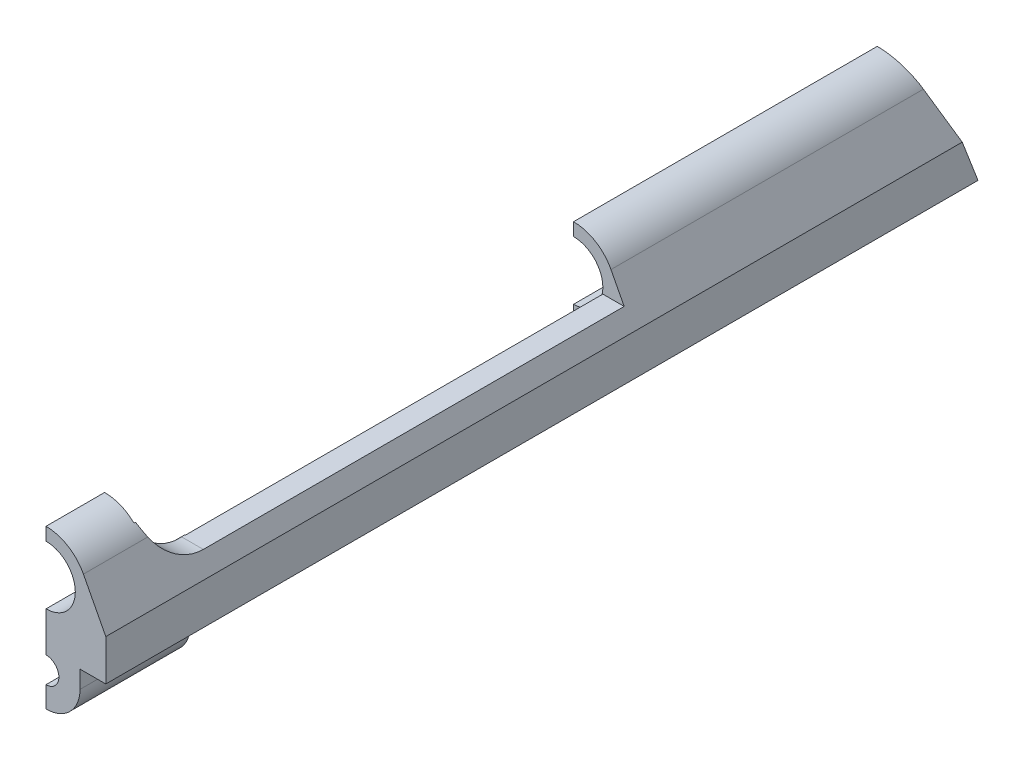
ISO-10303-21;
HEADER;
FILE_DESCRIPTION(('STEP AP214'),'2;1');
FILE_NAME('part.step','',(''),(''),'','','');
FILE_SCHEMA(('AUTOMOTIVE_DESIGN { 1 0 10303 214 1 1 1 1 }'));
ENDSEC;
DATA;
#1=APPLICATION_CONTEXT('core data for automotive mechanical design processes');
#2=APPLICATION_PROTOCOL_DEFINITION('international standard','automotive_design',2000,#1);
#3=PRODUCT_CONTEXT('',#1,'mechanical');
#4=PRODUCT('Part','Part','',(#3));
#5=PRODUCT_RELATED_PRODUCT_CATEGORY('part','',(#4));
#6=PRODUCT_DEFINITION_FORMATION('','',#4);
#7=PRODUCT_DEFINITION_CONTEXT('part definition',#1,'design');
#8=PRODUCT_DEFINITION('design','',#6,#7);
#9=PRODUCT_DEFINITION_SHAPE('','',#8);
#10=(LENGTH_UNIT() NAMED_UNIT(*) SI_UNIT(.MILLI.,.METRE.));
#11=(NAMED_UNIT(*) PLANE_ANGLE_UNIT() SI_UNIT($,.RADIAN.));
#12=(NAMED_UNIT(*) SI_UNIT($,.STERADIAN.) SOLID_ANGLE_UNIT());
#13=UNCERTAINTY_MEASURE_WITH_UNIT(LENGTH_MEASURE(1.E-05),#10,'distance_accuracy_value','');
#14=(GEOMETRIC_REPRESENTATION_CONTEXT(3) GLOBAL_UNCERTAINTY_ASSIGNED_CONTEXT((#13)) GLOBAL_UNIT_ASSIGNED_CONTEXT((#10,
#11,#12)) REPRESENTATION_CONTEXT('',''));
#15=CARTESIAN_POINT('',(0.,0.,0.));
#16=DIRECTION('',(0.,0.,1.));
#17=DIRECTION('',(1.,0.,0.));
#18=AXIS2_PLACEMENT_3D('',#15,#16,#17);
#19=CARTESIAN_POINT('',(0.,0.,0.));
#20=DIRECTION('',(-1.,0.,0.));
#21=DIRECTION('',(0.,0.,1.));
#22=AXIS2_PLACEMENT_3D('',#19,#20,#21);
#23=PLANE('',#22);
#24=DIRECTION('',(0.,-0.9335804264972,-0.358367949545305));
#25=VECTOR('',#24,1.);
#26=CARTESIAN_POINT('',(0.,64.6601194488688,-168.445370098041));
#27=LINE('',#26,#25);
#28=CARTESIAN_POINT('',(0.,18.542,-186.148457517929));
#29=VERTEX_POINT('',#28);
#30=CARTESIAN_POINT('',(0.,34.29,-180.103366694191));
#31=VERTEX_POINT('',#30);
#32=EDGE_CURVE('E68',#29,#31,#27,.F.);
#33=ORIENTED_EDGE('',*,*,#32,.F.);
#34=DIRECTION('',(0.,0.,-1.));
#35=VECTOR('',#34,1.);
#36=CARTESIAN_POINT('',(0.,18.542,-121.666));
#37=LINE('',#36,#35);
#38=CARTESIAN_POINT('',(0.,18.542,-121.666));
#39=VERTEX_POINT('',#38);
#40=EDGE_CURVE('E78',#39,#29,#37,.T.);
#41=ORIENTED_EDGE('',*,*,#40,.F.);
#42=DIRECTION('',(0.,-1.,0.));
#43=VECTOR('',#42,1.);
#44=CARTESIAN_POINT('',(0.,0.,-121.666));
#45=LINE('',#44,#43);
#46=CARTESIAN_POINT('',(0.,11.176,-121.666));
#47=VERTEX_POINT('',#46);
#48=EDGE_CURVE('E412',#39,#47,#45,.T.);
#49=ORIENTED_EDGE('',*,*,#48,.T.);
#50=DIRECTION('',(0.,0.,-1.));
#51=VECTOR('',#50,1.);
#52=CARTESIAN_POINT('',(0.,11.176,-188.976));
#53=LINE('',#52,#51);
#54=CARTESIAN_POINT('',(0.,11.176,-114.3));
#55=VERTEX_POINT('',#54);
#56=EDGE_CURVE('E275',#55,#47,#53,.T.);
#57=ORIENTED_EDGE('',*,*,#56,.F.);
#58=DIRECTION('',(0.,1.,0.));
#59=VECTOR('',#58,1.);
#60=CARTESIAN_POINT('',(0.,0.,-114.3));
#61=LINE('',#60,#59);
#62=CARTESIAN_POINT('',(0.,18.796,-114.3));
#63=VERTEX_POINT('',#62);
#64=EDGE_CURVE('E243',#55,#63,#61,.T.);
#65=ORIENTED_EDGE('',*,*,#64,.T.);
#66=DIRECTION('',(0.,0.,1.));
#67=VECTOR('',#66,1.);
#68=CARTESIAN_POINT('',(0.,18.796,-121.412));
#69=LINE('',#68,#67);
#70=CARTESIAN_POINT('',(0.,18.796,-121.412));
#71=VERTEX_POINT('',#70);
#72=EDGE_CURVE('E301',#71,#63,#69,.T.);
#73=ORIENTED_EDGE('',*,*,#72,.F.);
#74=DIRECTION('',(0.,-1.,0.));
#75=VECTOR('',#74,1.);
#76=CARTESIAN_POINT('',(0.,0.,-121.412));
#77=LINE('',#76,#75);
#78=CARTESIAN_POINT('',(0.,31.496,-121.412));
#79=VERTEX_POINT('',#78);
#80=EDGE_CURVE('E289',#79,#71,#77,.T.);
#81=ORIENTED_EDGE('',*,*,#80,.F.);
#82=DIRECTION('',(0.,0.,1.));
#83=VECTOR('',#82,1.);
#84=CARTESIAN_POINT('',(0.,31.496,-121.412));
#85=LINE('',#84,#83);
#86=CARTESIAN_POINT('',(0.,31.496,-114.3));
#87=VERTEX_POINT('',#86);
#88=EDGE_CURVE('E296',#79,#87,#85,.T.);
#89=ORIENTED_EDGE('',*,*,#88,.T.);
#90=CARTESIAN_POINT('',(0.,34.29,-114.3));
#91=VERTEX_POINT('',#90);
#92=EDGE_CURVE('E240',#87,#91,#61,.T.);
#93=ORIENTED_EDGE('',*,*,#92,.T.);
#94=DIRECTION('',(0.,0.,1.));
#95=VECTOR('',#94,1.);
#96=CARTESIAN_POINT('',(0.,34.29,0.));
#97=LINE('',#96,#95);
#98=EDGE_CURVE('E307',#31,#91,#97,.T.);
#99=ORIENTED_EDGE('',*,*,#98,.F.);
#100=EDGE_LOOP('',(#33,#41,#49,#57,#65,#73,#81,#89,#93,#99));
#101=FACE_BOUND('',#100,.T.);
#102=ADVANCED_FACE('F34',(#101),#23,.T.);
#103=CARTESIAN_POINT('',(12.954,11.176,-188.976));
#104=DIRECTION('',(0.,1.,0.));
#105=DIRECTION('',(0.,0.,1.));
#106=AXIS2_PLACEMENT_3D('',#103,#104,#105);
#107=PLANE('',#106);
#108=DIRECTION('',(0.,0.,-1.));
#109=VECTOR('',#108,1.);
#110=CARTESIAN_POINT('',(8.382,11.176,-121.666));
#111=LINE('',#110,#109);
#112=CARTESIAN_POINT('',(8.382,11.176,-121.666));
#113=VERTEX_POINT('',#112);
#114=CARTESIAN_POINT('',(8.382,11.176,-188.976));
#115=VERTEX_POINT('',#114);
#116=EDGE_CURVE('E359',#113,#115,#111,.T.);
#117=ORIENTED_EDGE('',*,*,#116,.T.);
#118=DIRECTION('',(-1.,0.,0.));
#119=VECTOR('',#118,1.);
#120=CARTESIAN_POINT('',(12.954,11.176,-188.976));
#121=LINE('',#120,#119);
#122=CARTESIAN_POINT('',(12.954,11.176,-188.976));
#123=VERTEX_POINT('',#122);
#124=EDGE_CURVE('E280',#123,#115,#121,.T.);
#125=ORIENTED_EDGE('',*,*,#124,.F.);
#126=DIRECTION('',(0.,0.,-1.));
#127=VECTOR('',#126,1.);
#128=CARTESIAN_POINT('',(12.954,11.176,-188.976));
#129=LINE('',#128,#127);
#130=CARTESIAN_POINT('',(12.954,11.176,0.));
#131=VERTEX_POINT('',#130);
#132=EDGE_CURVE('E271',#131,#123,#129,.T.);
#133=ORIENTED_EDGE('',*,*,#132,.F.);
#134=DIRECTION('',(1.,0.,0.));
#135=VECTOR('',#134,1.);
#136=CARTESIAN_POINT('',(0.,11.176,0.));
#137=LINE('',#136,#135);
#138=CARTESIAN_POINT('',(7.366,11.176,0.));
#139=VERTEX_POINT('',#138);
#140=EDGE_CURVE('E257',#139,#131,#137,.T.);
#141=ORIENTED_EDGE('',*,*,#140,.F.);
#142=DIRECTION('',(0.,0.,1.));
#143=VECTOR('',#142,1.);
#144=CARTESIAN_POINT('',(7.366,11.176,-25.4));
#145=LINE('',#144,#143);
#146=CARTESIAN_POINT('',(7.366,11.176,-23.876));
#147=VERTEX_POINT('',#146);
#148=EDGE_CURVE('E263',#147,#139,#145,.T.);
#149=ORIENTED_EDGE('',*,*,#148,.F.);
#150=DIRECTION('',(-1.,0.,0.));
#151=VECTOR('',#150,1.);
#152=CARTESIAN_POINT('',(12.954,11.176,-23.876));
#153=LINE('',#152,#151);
#154=CARTESIAN_POINT('',(6.35,11.176,-23.876));
#155=VERTEX_POINT('',#154);
#156=EDGE_CURVE('E274',#147,#155,#153,.T.);
#157=ORIENTED_EDGE('',*,*,#156,.T.);
#158=DIRECTION('',(0.,0.,-1.));
#159=VECTOR('',#158,1.);
#160=CARTESIAN_POINT('',(6.35,11.176,-188.976));
#161=LINE('',#160,#159);
#162=CARTESIAN_POINT('',(6.35,11.176,-114.3));
#163=VERTEX_POINT('',#162);
#164=EDGE_CURVE('E320',#155,#163,#161,.T.);
#165=ORIENTED_EDGE('',*,*,#164,.T.);
#166=DIRECTION('',(1.,0.,0.));
#167=VECTOR('',#166,1.);
#168=CARTESIAN_POINT('',(12.954,11.176,-114.3));
#169=LINE('',#168,#167);
#170=EDGE_CURVE('E323',#55,#163,#169,.T.);
#171=ORIENTED_EDGE('',*,*,#170,.F.);
#172=ORIENTED_EDGE('',*,*,#56,.T.);
#173=DIRECTION('',(-1.,0.,0.));
#174=VECTOR('',#173,1.);
#175=CARTESIAN_POINT('',(0.,11.176,-121.666));
#176=LINE('',#175,#174);
#177=EDGE_CURVE('E371',#113,#47,#176,.T.);
#178=ORIENTED_EDGE('',*,*,#177,.F.);
#179=EDGE_LOOP('',(#117,#125,#133,#141,#149,#157,#165,#171,#172,#178));
#180=FACE_BOUND('',#179,.T.);
#181=ADVANCED_FACE('F368',(#180),#107,.F.);
#182=CARTESIAN_POINT('',(12.954,64.6601194488688,-168.445370098041));
#183=DIRECTION('',(0.,-0.358367949545305,0.9335804264972));
#184=DIRECTION('',(0.,-0.9335804264972,-0.358367949545305));
#185=AXIS2_PLACEMENT_3D('',#182,#183,#184);
#186=PLANE('',#185);
#187=DIRECTION('',(1.,0.,0.));
#188=VECTOR('',#187,1.);
#189=CARTESIAN_POINT('',(12.954,18.542,-186.148457517929));
#190=LINE('',#189,#188);
#191=CARTESIAN_POINT('',(10.922,18.542,-186.148457517929));
#192=VERTEX_POINT('',#191);
#193=EDGE_CURVE('E11',#29,#192,#190,.T.);
#194=ORIENTED_EDGE('',*,*,#193,.F.);
#195=ORIENTED_EDGE('',*,*,#32,.T.);
#196=CARTESIAN_POINT('',(0.,25.146,-183.613419430555));
#197=DIRECTION('',(0.,-0.358367949545305,0.9335804264972));
#198=DIRECTION('',(0.,0.9335804264972,0.358367949545305));
#199=AXIS2_PLACEMENT_3D('',#196,#197,#198);
#200=ELLIPSE('',#199,9.79454982181702,9.14400000000001);
#201=CARTESIAN_POINT('',(8.11056319740007,29.3687361533702,-181.992462891833));
#202=VERTEX_POINT('',#201);
#203=EDGE_CURVE('E57',#31,#202,#200,.F.);
#204=ORIENTED_EDGE('',*,*,#203,.T.);
#205=DIRECTION('',(-0.437159423527798,0.839647328908161,0.3223104116814));
#206=VECTOR('',#205,1.);
#207=CARTESIAN_POINT('',(18.324635074471,9.7506798853615,-189.523129130422));
#208=LINE('',#207,#206);
#209=CARTESIAN_POINT('',(12.954,20.066,-185.563448728535));
#210=VERTEX_POINT('',#209);
#211=EDGE_CURVE('E337',#210,#202,#208,.T.);
#212=ORIENTED_EDGE('',*,*,#211,.F.);
#213=DIRECTION('',(0.,0.9335804264972,0.358367949545305));
#214=VECTOR('',#213,1.);
#215=CARTESIAN_POINT('',(12.954,64.6601194488688,-168.445370098041));
#216=LINE('',#215,#214);
#217=EDGE_CURVE('E375',#123,#210,#216,.T.);
#218=ORIENTED_EDGE('',*,*,#217,.F.);
#219=ORIENTED_EDGE('',*,*,#124,.T.);
#220=DIRECTION('',(0.,-0.9335804264972,-0.358367949545305));
#221=VECTOR('',#220,1.);
#222=CARTESIAN_POINT('',(8.382,64.6601194488688,-168.445370098041));
#223=LINE('',#222,#221);
#224=CARTESIAN_POINT('',(8.382,13.97,-187.903483886111));
#225=VERTEX_POINT('',#224);
#226=EDGE_CURVE('E42',#225,#115,#223,.T.);
#227=ORIENTED_EDGE('',*,*,#226,.F.);
#228=DIRECTION('',(1.,0.,0.));
#229=VECTOR('',#228,1.);
#230=CARTESIAN_POINT('',(12.954,13.97,-187.903483886111));
#231=LINE('',#230,#229);
#232=CARTESIAN_POINT('',(10.922,13.97,-187.903483886111));
#233=VERTEX_POINT('',#232);
#234=EDGE_CURVE('E347',#225,#233,#231,.T.);
#235=ORIENTED_EDGE('',*,*,#234,.T.);
#236=DIRECTION('',(0.,-0.9335804264972,-0.358367949545305));
#237=VECTOR('',#236,1.);
#238=CARTESIAN_POINT('',(10.922,64.6601194488688,-168.445370098041));
#239=LINE('',#238,#237);
#240=EDGE_CURVE('E339',#192,#233,#239,.T.);
#241=ORIENTED_EDGE('',*,*,#240,.F.);
#242=EDGE_LOOP('',(#194,#195,#204,#212,#218,#219,#227,#235,#241));
#243=FACE_BOUND('',#242,.T.);
#244=ADVANCED_FACE('F373',(#243),#186,.F.);
#245=CARTESIAN_POINT('',(6.35,0.,0.));
#246=DIRECTION('',(1.,0.,0.));
#247=DIRECTION('',(0.,0.,-1.));
#248=AXIS2_PLACEMENT_3D('',#245,#246,#247);
#249=PLANE('',#248);
#250=DIRECTION('',(0.,1.,0.));
#251=VECTOR('',#250,1.);
#252=CARTESIAN_POINT('',(6.35,0.,-23.876));
#253=LINE('',#252,#251);
#254=CARTESIAN_POINT('',(6.35,23.876,-23.876));
#255=VERTEX_POINT('',#254);
#256=EDGE_CURVE('E239',#155,#255,#253,.T.);
#257=ORIENTED_EDGE('',*,*,#256,.T.);
#258=DIRECTION('',(0.,0.,1.));
#259=VECTOR('',#258,1.);
#260=CARTESIAN_POINT('',(6.35,23.876,0.));
#261=LINE('',#260,#259);
#262=CARTESIAN_POINT('',(6.35,23.876,-114.3));
#263=VERTEX_POINT('',#262);
#264=EDGE_CURVE('E345',#263,#255,#261,.T.);
#265=ORIENTED_EDGE('',*,*,#264,.F.);
#266=DIRECTION('',(0.,1.,0.));
#267=VECTOR('',#266,1.);
#268=CARTESIAN_POINT('',(6.35,0.,-114.3));
#269=LINE('',#268,#267);
#270=EDGE_CURVE('E244',#163,#263,#269,.T.);
#271=ORIENTED_EDGE('',*,*,#270,.F.);
#272=ORIENTED_EDGE('',*,*,#164,.F.);
#273=EDGE_LOOP('',(#257,#265,#271,#272));
#274=FACE_BOUND('',#273,.T.);
#275=ADVANCED_FACE('F401',(#274),#249,.F.);
#276=CARTESIAN_POINT('',(0.,25.146,-188.976));
#277=DIRECTION('',(0.,0.,1.));
#278=DIRECTION('',(1.,0.,0.));
#279=AXIS2_PLACEMENT_3D('',#276,#277,#278);
#280=CYLINDRICAL_SURFACE('',#279,9.14400000000001);
#281=ORIENTED_EDGE('',*,*,#203,.F.);
#282=ORIENTED_EDGE('',*,*,#98,.T.);
#283=CARTESIAN_POINT('',(0.,25.146,-114.3));
#284=DIRECTION('',(0.,0.,1.));
#285=DIRECTION('',(1.,0.,0.));
#286=AXIS2_PLACEMENT_3D('',#283,#284,#285);
#287=CIRCLE('',#286,9.14400000000001);
#288=CARTESIAN_POINT('',(8.11056319740007,29.3687361533702,-114.3));
#289=VERTEX_POINT('',#288);
#290=EDGE_CURVE('E212',#289,#91,#287,.T.);
#291=ORIENTED_EDGE('',*,*,#290,.F.);
#292=DIRECTION('',(0.,0.,1.));
#293=VECTOR('',#292,1.);
#294=CARTESIAN_POINT('',(8.11056319740007,29.3687361533702,-188.976));
#295=LINE('',#294,#293);
#296=EDGE_CURVE('E525',#202,#289,#295,.T.);
#297=ORIENTED_EDGE('',*,*,#296,.F.);
#298=EDGE_LOOP('',(#281,#282,#291,#297));
#299=FACE_BOUND('',#298,.T.);
#300=ADVANCED_FACE('F470',(#299),#280,.T.);
#301=CARTESIAN_POINT('',(12.954,0.,0.));
#302=DIRECTION('',(0.,0.,-1.));
#303=DIRECTION('',(-1.,0.,0.));
#304=AXIS2_PLACEMENT_3D('',#301,#302,#303);
#305=PLANE('',#304);
#306=CARTESIAN_POINT('',(0.,25.146,0.));
#307=DIRECTION('',(0.,0.,1.));
#308=DIRECTION('',(1.,0.,0.));
#309=AXIS2_PLACEMENT_3D('',#306,#307,#308);
#310=CIRCLE('',#309,9.14400000000001);
#311=CARTESIAN_POINT('',(8.11056319740007,29.3687361533702,0.));
#312=VERTEX_POINT('',#311);
#313=CARTESIAN_POINT('',(0.,34.29,0.));
#314=VERTEX_POINT('',#313);
#315=EDGE_CURVE('E449',#312,#314,#310,.T.);
#316=ORIENTED_EDGE('',*,*,#315,.T.);
#317=DIRECTION('',(0.,-1.,0.));
#318=VECTOR('',#317,1.);
#319=CARTESIAN_POINT('',(0.,0.,0.));
#320=LINE('',#319,#318);
#321=CARTESIAN_POINT('',(0.,31.496,0.));
#322=VERTEX_POINT('',#321);
#323=EDGE_CURVE('E308',#314,#322,#320,.T.);
#324=ORIENTED_EDGE('',*,*,#323,.T.);
#325=CARTESIAN_POINT('',(0.,25.146,0.));
#326=DIRECTION('',(0.,0.,1.));
#327=DIRECTION('',(1.,0.,0.));
#328=AXIS2_PLACEMENT_3D('',#325,#326,#327);
#329=CIRCLE('',#328,6.35);
#330=CARTESIAN_POINT('',(0.,18.796,0.));
#331=VERTEX_POINT('',#330);
#332=EDGE_CURVE('E287',#331,#322,#329,.T.);
#333=ORIENTED_EDGE('',*,*,#332,.F.);
#334=CARTESIAN_POINT('',(0.,10.16,0.));
#335=VERTEX_POINT('',#334);
#336=EDGE_CURVE('E312',#331,#335,#320,.T.);
#337=ORIENTED_EDGE('',*,*,#336,.T.);
#338=CARTESIAN_POINT('',(0.,7.366,0.));
#339=DIRECTION('',(0.,0.,1.));
#340=DIRECTION('',(1.,0.,0.));
#341=AXIS2_PLACEMENT_3D('',#338,#339,#340);
#342=CIRCLE('',#341,2.794);
#343=CARTESIAN_POINT('',(0.,4.572,0.));
#344=VERTEX_POINT('',#343);
#345=EDGE_CURVE('E281',#344,#335,#342,.T.);
#346=ORIENTED_EDGE('',*,*,#345,.F.);
#347=CARTESIAN_POINT('',(0.,0.,0.));
#348=VERTEX_POINT('',#347);
#349=EDGE_CURVE('E299',#344,#348,#320,.T.);
#350=ORIENTED_EDGE('',*,*,#349,.T.);
#351=CARTESIAN_POINT('',(0.,7.366,0.));
#352=DIRECTION('',(0.,0.,1.));
#353=DIRECTION('',(1.,0.,0.));
#354=AXIS2_PLACEMENT_3D('',#351,#352,#353);
#355=CIRCLE('',#354,7.366);
#356=CARTESIAN_POINT('',(7.366,7.366,0.));
#357=VERTEX_POINT('',#356);
#358=EDGE_CURVE('E254',#348,#357,#355,.T.);
#359=ORIENTED_EDGE('',*,*,#358,.T.);
#360=DIRECTION('',(0.,1.,0.));
#361=VECTOR('',#360,1.);
#362=CARTESIAN_POINT('',(7.366,0.,0.));
#363=LINE('',#362,#361);
#364=EDGE_CURVE('E260',#357,#139,#363,.T.);
#365=ORIENTED_EDGE('',*,*,#364,.T.);
#366=ORIENTED_EDGE('',*,*,#140,.T.);
#367=DIRECTION('',(0.,-1.,0.));
#368=VECTOR('',#367,1.);
#369=CARTESIAN_POINT('',(12.954,0.,0.));
#370=LINE('',#369,#368);
#371=CARTESIAN_POINT('',(12.954,20.066,0.));
#372=VERTEX_POINT('',#371);
#373=EDGE_CURVE('E304',#372,#131,#370,.T.);
#374=ORIENTED_EDGE('',*,*,#373,.F.);
#375=DIRECTION('',(0.461804041269704,-0.886981976968512,0.));
#376=VECTOR('',#375,1.);
#377=CARTESIAN_POINT('',(18.410663066615,9.58544686068576,0.));
#378=LINE('',#377,#376);
#379=EDGE_CURVE('E528',#312,#372,#378,.T.);
#380=ORIENTED_EDGE('',*,*,#379,.F.);
#381=EDGE_LOOP('',(#316,#324,#333,#337,#346,#350,#359,#365,#366,#374,#380));
#382=FACE_BOUND('',#381,.T.);
#383=ADVANCED_FACE('F36',(#382),#305,.F.);
#384=DIRECTION('',(0.,0.,1.));
#385=VECTOR('',#384,1.);
#386=CARTESIAN_POINT('',(6.35,31.7255315942702,-188.976));
#387=LINE('',#386,#385);
#388=CARTESIAN_POINT('',(6.35,31.7255315942702,-13.0206904438626));
#389=VERTEX_POINT('',#388);
#390=CARTESIAN_POINT('',(6.35,31.7255315942702,-12.7));
#391=VERTEX_POINT('',#390);
#392=EDGE_CURVE('E202',#389,#391,#387,.T.);
#393=ORIENTED_EDGE('',*,*,#392,.F.);
#394=CARTESIAN_POINT('',(6.35,34.29,-23.114));
#395=DIRECTION('',(-1.,0.,0.));
#396=DIRECTION('',(0.,0.,1.));
#397=AXIS2_PLACEMENT_3D('',#394,#395,#396);
#398=CIRCLE('',#397,10.414);
#399=CARTESIAN_POINT('',(6.35,23.876,-23.114));
#400=VERTEX_POINT('',#399);
#401=EDGE_CURVE('E436',#400,#389,#398,.T.);
#402=ORIENTED_EDGE('',*,*,#401,.F.);
#403=DIRECTION('',(0.,0.,-1.));
#404=VECTOR('',#403,1.);
#405=CARTESIAN_POINT('',(6.35,23.876,0.));
#406=LINE('',#405,#404);
#407=CARTESIAN_POINT('',(6.35,23.876,-12.7));
#408=VERTEX_POINT('',#407);
#409=EDGE_CURVE('E520',#408,#400,#406,.T.);
#410=ORIENTED_EDGE('',*,*,#409,.F.);
#411=DIRECTION('',(0.,1.,0.));
#412=VECTOR('',#411,1.);
#413=CARTESIAN_POINT('',(6.35,23.876,-12.7));
#414=LINE('',#413,#412);
#415=CARTESIAN_POINT('',(6.35,25.146,-12.7));
#416=VERTEX_POINT('',#415);
#417=EDGE_CURVE('E229',#408,#416,#414,.T.);
#418=ORIENTED_EDGE('',*,*,#417,.T.);
#419=EDGE_CURVE('E218',#416,#391,#414,.T.);
#420=ORIENTED_EDGE('',*,*,#419,.T.);
#421=EDGE_LOOP('',(#393,#402,#410,#418,#420));
#422=FACE_BOUND('',#421,.T.);
#423=ADVANCED_FACE('F226',(#422),#249,.F.);
#424=CARTESIAN_POINT('',(0.,23.876,-12.7));
#425=DIRECTION('',(0.,0.,1.));
#426=DIRECTION('',(1.,0.,0.));
#427=AXIS2_PLACEMENT_3D('',#424,#425,#426);
#428=PLANE('',#427);
#429=CARTESIAN_POINT('',(0.,25.146,-12.7));
#430=DIRECTION('',(0.,0.,1.));
#431=DIRECTION('',(1.,0.,0.));
#432=AXIS2_PLACEMENT_3D('',#429,#430,#431);
#433=CIRCLE('',#432,9.14400000000001);
#434=CARTESIAN_POINT('',(0.,34.29,-12.7));
#435=VERTEX_POINT('',#434);
#436=EDGE_CURVE('E205',#391,#435,#433,.T.);
#437=ORIENTED_EDGE('',*,*,#436,.F.);
#438=ORIENTED_EDGE('',*,*,#419,.F.);
#439=CARTESIAN_POINT('',(0.,25.146,-12.7));
#440=DIRECTION('',(0.,0.,1.));
#441=DIRECTION('',(1.,0.,0.));
#442=AXIS2_PLACEMENT_3D('',#439,#440,#441);
#443=CIRCLE('',#442,6.35);
#444=CARTESIAN_POINT('',(0.,31.496,-12.7));
#445=VERTEX_POINT('',#444);
#446=EDGE_CURVE('E224',#445,#416,#443,.F.);
#447=ORIENTED_EDGE('',*,*,#446,.F.);
#448=DIRECTION('',(0.,1.,0.));
#449=VECTOR('',#448,1.);
#450=CARTESIAN_POINT('',(0.,23.876,-12.7));
#451=LINE('',#450,#449);
#452=EDGE_CURVE('E221',#445,#435,#451,.T.);
#453=ORIENTED_EDGE('',*,*,#452,.T.);
#454=EDGE_LOOP('',(#437,#438,#447,#453));
#455=FACE_BOUND('',#454,.T.);
#456=ADVANCED_FACE('F217',(#455),#428,.F.);
#457=CARTESIAN_POINT('',(0.,25.146,-121.412));
#458=DIRECTION('',(0.,0.,1.));
#459=DIRECTION('',(1.,0.,0.));
#460=AXIS2_PLACEMENT_3D('',#457,#458,#459);
#461=CYLINDRICAL_SURFACE('',#460,6.35);
#462=EDGE_CURVE('E300',#445,#322,#85,.T.);
#463=ORIENTED_EDGE('',*,*,#462,.F.);
#464=ORIENTED_EDGE('',*,*,#446,.T.);
#465=CARTESIAN_POINT('',(6.22170394666927,23.876,-12.7));
#466=VERTEX_POINT('',#465);
#467=EDGE_CURVE('E326',#416,#466,#443,.F.);
#468=ORIENTED_EDGE('',*,*,#467,.T.);
#469=DIRECTION('',(0.,0.,1.));
#470=VECTOR('',#469,1.);
#471=CARTESIAN_POINT('',(6.22170394666927,23.876,-121.412));
#472=LINE('',#471,#470);
#473=CARTESIAN_POINT('',(6.22170394666927,23.876,-23.876));
#474=VERTEX_POINT('',#473);
#475=EDGE_CURVE('E232',#474,#466,#472,.T.);
#476=ORIENTED_EDGE('',*,*,#475,.F.);
#477=CARTESIAN_POINT('',(0.,25.146,-23.876));
#478=DIRECTION('',(0.,0.,-1.));
#479=DIRECTION('',(-1.,0.,0.));
#480=AXIS2_PLACEMENT_3D('',#477,#478,#479);
#481=CIRCLE('',#480,6.35);
#482=CARTESIAN_POINT('',(0.,18.796,-23.876));
#483=VERTEX_POINT('',#482);
#484=EDGE_CURVE('E249',#483,#474,#481,.F.);
#485=ORIENTED_EDGE('',*,*,#484,.F.);
#486=EDGE_CURVE('E293',#483,#331,#69,.T.);
#487=ORIENTED_EDGE('',*,*,#486,.T.);
#488=ORIENTED_EDGE('',*,*,#332,.T.);
#489=EDGE_LOOP('',(#463,#464,#468,#476,#485,#487,#488));
#490=FACE_BOUND('',#489,.T.);
#491=ADVANCED_FACE('F487',(#490),#461,.F.);
#492=CARTESIAN_POINT('',(12.954,0.,-23.876));
#493=DIRECTION('',(0.,0.,1.));
#494=DIRECTION('',(1.,0.,0.));
#495=AXIS2_PLACEMENT_3D('',#492,#493,#494);
#496=PLANE('',#495);
#497=DIRECTION('',(-1.,0.,0.));
#498=VECTOR('',#497,1.);
#499=CARTESIAN_POINT('',(0.,23.876,-23.876));
#500=LINE('',#499,#498);
#501=EDGE_CURVE('E398',#255,#474,#500,.T.);
#502=ORIENTED_EDGE('',*,*,#501,.F.);
#503=ORIENTED_EDGE('',*,*,#256,.F.);
#504=ORIENTED_EDGE('',*,*,#156,.F.);
#505=DIRECTION('',(0.,1.,0.));
#506=VECTOR('',#505,1.);
#507=CARTESIAN_POINT('',(7.366,0.,-23.876));
#508=LINE('',#507,#506);
#509=CARTESIAN_POINT('',(7.366,7.366,-23.876));
#510=VERTEX_POINT('',#509);
#511=EDGE_CURVE('E266',#510,#147,#508,.T.);
#512=ORIENTED_EDGE('',*,*,#511,.F.);
#513=CARTESIAN_POINT('',(0.,7.366,-23.876));
#514=DIRECTION('',(0.,0.,1.));
#515=DIRECTION('',(1.,0.,0.));
#516=AXIS2_PLACEMENT_3D('',#513,#514,#515);
#517=CIRCLE('',#516,7.366);
#518=CARTESIAN_POINT('',(0.,0.,-23.876));
#519=VERTEX_POINT('',#518);
#520=EDGE_CURVE('E318',#519,#510,#517,.T.);
#521=ORIENTED_EDGE('',*,*,#520,.F.);
#522=DIRECTION('',(0.,1.,0.));
#523=VECTOR('',#522,1.);
#524=CARTESIAN_POINT('',(0.,0.,-23.876));
#525=LINE('',#524,#523);
#526=CARTESIAN_POINT('',(0.,4.572,-23.876));
#527=VERTEX_POINT('',#526);
#528=EDGE_CURVE('E276',#519,#527,#525,.T.);
#529=ORIENTED_EDGE('',*,*,#528,.T.);
#530=CARTESIAN_POINT('',(0.,7.366,-23.876));
#531=DIRECTION('',(0.,0.,1.));
#532=DIRECTION('',(1.,0.,0.));
#533=AXIS2_PLACEMENT_3D('',#530,#531,#532);
#534=CIRCLE('',#533,2.794);
#535=CARTESIAN_POINT('',(0.,10.16,-23.876));
#536=VERTEX_POINT('',#535);
#537=EDGE_CURVE('E306',#536,#527,#534,.F.);
#538=ORIENTED_EDGE('',*,*,#537,.F.);
#539=EDGE_CURVE('E270',#536,#483,#525,.T.);
#540=ORIENTED_EDGE('',*,*,#539,.T.);
#541=ORIENTED_EDGE('',*,*,#484,.T.);
#542=EDGE_LOOP('',(#502,#503,#504,#512,#521,#529,#538,#540,#541));
#543=FACE_BOUND('',#542,.T.);
#544=ADVANCED_FACE('F396',(#543),#496,.F.);
#545=ORIENTED_EDGE('',*,*,#452,.F.);
#546=ORIENTED_EDGE('',*,*,#462,.T.);
#547=ORIENTED_EDGE('',*,*,#323,.F.);
#548=EDGE_CURVE('E314',#435,#314,#97,.T.);
#549=ORIENTED_EDGE('',*,*,#548,.F.);
#550=EDGE_LOOP('',(#545,#546,#547,#549));
#551=FACE_BOUND('',#550,.T.);
#552=ADVANCED_FACE('F472',(#551),#23,.T.);
#553=ORIENTED_EDGE('',*,*,#486,.F.);
#554=ORIENTED_EDGE('',*,*,#539,.F.);
#555=DIRECTION('',(0.,0.,1.));
#556=VECTOR('',#555,1.);
#557=CARTESIAN_POINT('',(0.,10.16,-25.4));
#558=LINE('',#557,#556);
#559=EDGE_CURVE('E285',#536,#335,#558,.T.);
#560=ORIENTED_EDGE('',*,*,#559,.T.);
#561=ORIENTED_EDGE('',*,*,#336,.F.);
#562=EDGE_LOOP('',(#553,#554,#560,#561));
#563=FACE_BOUND('',#562,.T.);
#564=ADVANCED_FACE('F471',(#563),#23,.T.);
#565=ORIENTED_EDGE('',*,*,#72,.T.);
#566=CARTESIAN_POINT('',(0.,25.146,-114.3));
#567=DIRECTION('',(0.,0.,1.));
#568=DIRECTION('',(1.,0.,0.));
#569=AXIS2_PLACEMENT_3D('',#566,#567,#568);
#570=CIRCLE('',#569,6.35);
#571=EDGE_CURVE('E252',#87,#63,#570,.F.);
#572=ORIENTED_EDGE('',*,*,#571,.F.);
#573=ORIENTED_EDGE('',*,*,#88,.F.);
#574=CARTESIAN_POINT('',(0.,25.146,-121.412));
#575=DIRECTION('',(0.,0.,1.));
#576=DIRECTION('',(1.,0.,0.));
#577=AXIS2_PLACEMENT_3D('',#574,#575,#576);
#578=CIRCLE('',#577,6.35);
#579=EDGE_CURVE('E291',#71,#79,#578,.T.);
#580=ORIENTED_EDGE('',*,*,#579,.F.);
#581=EDGE_LOOP('',(#565,#572,#573,#580));
#582=FACE_BOUND('',#581,.T.);
#583=ADVANCED_FACE('F479',(#582),#461,.F.);
#584=CARTESIAN_POINT('',(12.954,0.,0.));
#585=DIRECTION('',(-1.,0.,0.));
#586=DIRECTION('',(0.,0.,1.));
#587=AXIS2_PLACEMENT_3D('',#584,#585,#586);
#588=PLANE('',#587);
#589=ORIENTED_EDGE('',*,*,#132,.T.);
#590=ORIENTED_EDGE('',*,*,#217,.T.);
#591=DIRECTION('',(0.,0.,1.));
#592=VECTOR('',#591,1.);
#593=CARTESIAN_POINT('',(12.954,20.066,-188.976));
#594=LINE('',#593,#592);
#595=EDGE_CURVE('E213',#210,#372,#594,.T.);
#596=ORIENTED_EDGE('',*,*,#595,.T.);
#597=ORIENTED_EDGE('',*,*,#373,.T.);
#598=EDGE_LOOP('',(#589,#590,#596,#597));
#599=FACE_BOUND('',#598,.T.);
#600=ADVANCED_FACE('F379',(#599),#588,.F.);
#601=ORIENTED_EDGE('',*,*,#528,.F.);
#602=DIRECTION('',(0.,0.,-1.));
#603=VECTOR('',#602,1.);
#604=CARTESIAN_POINT('',(0.,0.,0.));
#605=LINE('',#604,#603);
#606=EDGE_CURVE('E311',#348,#519,#605,.T.);
#607=ORIENTED_EDGE('',*,*,#606,.F.);
#608=ORIENTED_EDGE('',*,*,#349,.F.);
#609=DIRECTION('',(0.,0.,1.));
#610=VECTOR('',#609,1.);
#611=CARTESIAN_POINT('',(0.,4.572,-25.4));
#612=LINE('',#611,#610);
#613=EDGE_CURVE('E284',#527,#344,#612,.T.);
#614=ORIENTED_EDGE('',*,*,#613,.F.);
#615=EDGE_LOOP('',(#601,#607,#608,#614));
#616=FACE_BOUND('',#615,.T.);
#617=ADVANCED_FACE('F481',(#616),#23,.T.);
#618=CARTESIAN_POINT('',(0.,0.,-121.412));
#619=DIRECTION('',(0.,0.,1.));
#620=DIRECTION('',(1.,0.,0.));
#621=AXIS2_PLACEMENT_3D('',#618,#619,#620);
#622=PLANE('',#621);
#623=ORIENTED_EDGE('',*,*,#80,.T.);
#624=ORIENTED_EDGE('',*,*,#579,.T.);
#625=EDGE_LOOP('',(#623,#624));
#626=FACE_BOUND('',#625,.T.);
#627=ADVANCED_FACE('F490',(#626),#622,.T.);
#628=CARTESIAN_POINT('',(0.,7.366,-25.4));
#629=DIRECTION('',(0.,0.,1.));
#630=DIRECTION('',(1.,0.,0.));
#631=AXIS2_PLACEMENT_3D('',#628,#629,#630);
#632=CYLINDRICAL_SURFACE('',#631,2.794);
#633=ORIENTED_EDGE('',*,*,#559,.F.);
#634=ORIENTED_EDGE('',*,*,#537,.T.);
#635=ORIENTED_EDGE('',*,*,#613,.T.);
#636=ORIENTED_EDGE('',*,*,#345,.T.);
#637=EDGE_LOOP('',(#633,#634,#635,#636));
#638=FACE_BOUND('',#637,.T.);
#639=ADVANCED_FACE('F496',(#638),#632,.F.);
#640=CARTESIAN_POINT('',(0.,7.366,-25.4));
#641=DIRECTION('',(0.,0.,1.));
#642=DIRECTION('',(1.,0.,0.));
#643=AXIS2_PLACEMENT_3D('',#640,#641,#642);
#644=CYLINDRICAL_SURFACE('',#643,7.366);
#645=ORIENTED_EDGE('',*,*,#520,.T.);
#646=DIRECTION('',(0.,0.,1.));
#647=VECTOR('',#646,1.);
#648=CARTESIAN_POINT('',(7.366,7.366,-25.4));
#649=LINE('',#648,#647);
#650=EDGE_CURVE('E264',#510,#357,#649,.T.);
#651=ORIENTED_EDGE('',*,*,#650,.T.);
#652=ORIENTED_EDGE('',*,*,#358,.F.);
#653=ORIENTED_EDGE('',*,*,#606,.T.);
#654=EDGE_LOOP('',(#645,#651,#652,#653));
#655=FACE_BOUND('',#654,.T.);
#656=ADVANCED_FACE('F565',(#655),#644,.T.);
#657=CARTESIAN_POINT('',(7.366,0.,-25.4));
#658=DIRECTION('',(1.,0.,0.));
#659=DIRECTION('',(0.,0.,-1.));
#660=AXIS2_PLACEMENT_3D('',#657,#658,#659);
#661=PLANE('',#660);
#662=ORIENTED_EDGE('',*,*,#511,.T.);
#663=ORIENTED_EDGE('',*,*,#148,.T.);
#664=ORIENTED_EDGE('',*,*,#364,.F.);
#665=ORIENTED_EDGE('',*,*,#650,.F.);
#666=EDGE_LOOP('',(#662,#663,#664,#665));
#667=FACE_BOUND('',#666,.T.);
#668=ADVANCED_FACE('F389',(#667),#661,.T.);
#669=CARTESIAN_POINT('',(0.,0.,-114.3));
#670=DIRECTION('',(0.,0.,1.));
#671=DIRECTION('',(1.,0.,0.));
#672=AXIS2_PLACEMENT_3D('',#669,#670,#671);
#673=PLANE('',#672);
#674=ORIENTED_EDGE('',*,*,#571,.T.);
#675=ORIENTED_EDGE('',*,*,#64,.F.);
#676=ORIENTED_EDGE('',*,*,#170,.T.);
#677=ORIENTED_EDGE('',*,*,#270,.T.);
#678=DIRECTION('',(-1.,0.,0.));
#679=VECTOR('',#678,1.);
#680=CARTESIAN_POINT('',(12.954,23.876,-114.3));
#681=LINE('',#680,#679);
#682=CARTESIAN_POINT('',(10.9703369234953,23.876,-114.3));
#683=VERTEX_POINT('',#682);
#684=EDGE_CURVE('E439',#683,#263,#681,.T.);
#685=ORIENTED_EDGE('',*,*,#684,.F.);
#686=DIRECTION('',(0.461804041269704,-0.886981976968512,0.));
#687=VECTOR('',#686,1.);
#688=CARTESIAN_POINT('',(18.410663066615,9.58544686068576,-114.3));
#689=LINE('',#688,#687);
#690=EDGE_CURVE('E334',#289,#683,#689,.T.);
#691=ORIENTED_EDGE('',*,*,#690,.F.);
#692=ORIENTED_EDGE('',*,*,#290,.T.);
#693=ORIENTED_EDGE('',*,*,#92,.F.);
#694=EDGE_LOOP('',(#674,#675,#676,#677,#685,#691,#692,#693));
#695=FACE_BOUND('',#694,.T.);
#696=ADVANCED_FACE('F404',(#695),#673,.T.);
#697=ORIENTED_EDGE('',*,*,#417,.F.);
#698=DIRECTION('',(1.,0.,0.));
#699=VECTOR('',#698,1.);
#700=CARTESIAN_POINT('',(0.,23.876,-12.7));
#701=LINE('',#700,#699);
#702=EDGE_CURVE('E233',#466,#408,#701,.T.);
#703=ORIENTED_EDGE('',*,*,#702,.F.);
#704=ORIENTED_EDGE('',*,*,#467,.F.);
#705=EDGE_LOOP('',(#697,#703,#704));
#706=FACE_BOUND('',#705,.T.);
#707=ADVANCED_FACE('F519',(#706),#428,.F.);
#708=CARTESIAN_POINT('',(0.,23.876,0.));
#709=DIRECTION('',(0.,1.,0.));
#710=DIRECTION('',(0.,0.,1.));
#711=AXIS2_PLACEMENT_3D('',#708,#709,#710);
#712=PLANE('',#711);
#713=ORIENTED_EDGE('',*,*,#475,.T.);
#714=ORIENTED_EDGE('',*,*,#702,.T.);
#715=ORIENTED_EDGE('',*,*,#409,.T.);
#716=DIRECTION('',(-1.,0.,0.));
#717=VECTOR('',#716,1.);
#718=CARTESIAN_POINT('',(12.954,23.876,-23.114));
#719=LINE('',#718,#717);
#720=CARTESIAN_POINT('',(10.9703369234953,23.876,-23.114));
#721=VERTEX_POINT('',#720);
#722=EDGE_CURVE('E438',#721,#400,#719,.T.);
#723=ORIENTED_EDGE('',*,*,#722,.F.);
#724=DIRECTION('',(0.,0.,1.));
#725=VECTOR('',#724,1.);
#726=CARTESIAN_POINT('',(10.9703369234953,23.876,-188.976));
#727=LINE('',#726,#725);
#728=EDGE_CURVE('E331',#683,#721,#727,.T.);
#729=ORIENTED_EDGE('',*,*,#728,.F.);
#730=ORIENTED_EDGE('',*,*,#684,.T.);
#731=ORIENTED_EDGE('',*,*,#264,.T.);
#732=ORIENTED_EDGE('',*,*,#501,.T.);
#733=EDGE_LOOP('',(#713,#714,#715,#723,#729,#730,#731,#732));
#734=FACE_BOUND('',#733,.T.);
#735=ADVANCED_FACE('F469',(#734),#712,.T.);
#736=CARTESIAN_POINT('',(6.35,31.7255315942702,-13.0206904438626));
#737=CARTESIAN_POINT('',(6.426233642521,31.6519588659701,-13.0393837381304));
#738=CARTESIAN_POINT('',(6.50103185798535,31.5772088782916,-13.0592323488904));
#739=CARTESIAN_POINT('',(6.64766745790555,31.4255208529392,-13.1013901355799));
#740=CARTESIAN_POINT('',(6.71950464239758,31.3485826680833,-13.1236994773143));
#741=CARTESIAN_POINT('',(6.93051220667178,31.1146534871096,-13.1945689762151));
#742=CARTESIAN_POINT('',(7.06508327930573,30.9546400507101,-13.2470476655386));
#743=CARTESIAN_POINT('',(7.31890139466737,30.6312494846611,-13.3623894040228));
#744=CARTESIAN_POINT('',(7.4383733351059,30.4679784938774,-13.4250570198993));
#745=CARTESIAN_POINT('',(7.66410455003925,30.137415991333,-13.5620684939703));
#746=CARTESIAN_POINT('',(7.77037456421474,29.9701278814482,-13.6364027485139));
#747=CARTESIAN_POINT('',(7.91240282886181,29.7300582447531,-13.7510587571431));
#748=CARTESIAN_POINT('',(7.95364739449664,29.6580981252215,-13.7864382414426));
#749=CARTESIAN_POINT('',(8.03386011078302,29.5136849710897,-13.8595532887219));
#750=CARTESIAN_POINT('',(8.07281918188856,29.441231099342,-13.8972971595323));
#751=CARTESIAN_POINT('',(8.11056319740017,29.3687361533702,-13.936170291847));
#752=B_SPLINE_CURVE_WITH_KNOTS('',3,(#736,#737,#738,#739,#740,#741,#742,#743,#744,#745,#746,
#747,#748,#749,#750,#751),.UNSPECIFIED.,.F.,.F.,(4,2,2,2,2,2,2,4),(0.,0.322700776151283,
0.645423309291132,1.29127084766363,1.92594112041703,2.56009166431385,2.83056014759101,
3.10203901536526),.UNSPECIFIED.);
#753=CARTESIAN_POINT('',(8.11056319740007,29.3687361533702,-13.9361702918472));
#754=VERTEX_POINT('',#753);
#755=EDGE_CURVE('E208',#389,#754,#752,.T.);
#756=ORIENTED_EDGE('',*,*,#755,.F.);
#757=ORIENTED_EDGE('',*,*,#392,.T.);
#758=ORIENTED_EDGE('',*,*,#436,.T.);
#759=ORIENTED_EDGE('',*,*,#548,.T.);
#760=ORIENTED_EDGE('',*,*,#315,.F.);
#761=EDGE_CURVE('E527',#754,#312,#295,.T.);
#762=ORIENTED_EDGE('',*,*,#761,.F.);
#763=EDGE_LOOP('',(#756,#757,#758,#759,#760,#762));
#764=FACE_BOUND('',#763,.T.);
#765=ADVANCED_FACE('F204',(#764),#280,.T.);
#766=CARTESIAN_POINT('',(18.410663066615,9.58544686068576,-188.976));
#767=DIRECTION('',(-0.886981976968512,-0.461804041269704,0.));
#768=DIRECTION('',(0.461804041269704,-0.886981976968512,0.));
#769=AXIS2_PLACEMENT_3D('',#766,#767,#768);
#770=PLANE('',#769);
#771=ORIENTED_EDGE('',*,*,#595,.F.);
#772=ORIENTED_EDGE('',*,*,#211,.T.);
#773=ORIENTED_EDGE('',*,*,#296,.T.);
#774=ORIENTED_EDGE('',*,*,#690,.T.);
#775=ORIENTED_EDGE('',*,*,#728,.T.);
#776=CARTESIAN_POINT('',(5.54832451438248,34.29,-23.114));
#777=DIRECTION('',(-0.886981976968512,-0.461804041269704,0.));
#778=DIRECTION('',(-0.461804041269704,0.886981976968512,0.));
#779=AXIS2_PLACEMENT_3D('',#776,#777,#778);
#780=ELLIPSE('',#779,11.7409375504929,10.414);
#781=EDGE_CURVE('E223',#721,#754,#780,.T.);
#782=ORIENTED_EDGE('',*,*,#781,.T.);
#783=ORIENTED_EDGE('',*,*,#761,.T.);
#784=ORIENTED_EDGE('',*,*,#379,.T.);
#785=EDGE_LOOP('',(#771,#772,#773,#774,#775,#782,#783,#784));
#786=FACE_BOUND('',#785,.T.);
#787=ADVANCED_FACE('F459',(#786),#770,.F.);
#788=CARTESIAN_POINT('',(12.954,34.29,-23.114));
#789=DIRECTION('',(-1.,0.,0.));
#790=DIRECTION('',(0.,0.,1.));
#791=AXIS2_PLACEMENT_3D('',#788,#789,#790);
#792=CYLINDRICAL_SURFACE('',#791,10.414);
#793=ORIENTED_EDGE('',*,*,#755,.T.);
#794=ORIENTED_EDGE('',*,*,#781,.F.);
#795=ORIENTED_EDGE('',*,*,#722,.T.);
#796=ORIENTED_EDGE('',*,*,#401,.T.);
#797=EDGE_LOOP('',(#793,#794,#795,#796));
#798=FACE_BOUND('',#797,.T.);
#799=ADVANCED_FACE('F454',(#798),#792,.F.);
#800=CARTESIAN_POINT('',(0.,18.542,-121.666));
#801=DIRECTION('',(0.,-1.,0.));
#802=DIRECTION('',(0.,0.,-1.));
#803=AXIS2_PLACEMENT_3D('',#800,#801,#802);
#804=PLANE('',#803);
#805=ORIENTED_EDGE('',*,*,#193,.T.);
#806=DIRECTION('',(0.,0.,-1.));
#807=VECTOR('',#806,1.);
#808=CARTESIAN_POINT('',(10.922,18.542,-121.666));
#809=LINE('',#808,#807);
#810=CARTESIAN_POINT('',(10.922,18.542,-121.666));
#811=VERTEX_POINT('',#810);
#812=EDGE_CURVE('E49',#811,#192,#809,.T.);
#813=ORIENTED_EDGE('',*,*,#812,.F.);
#814=DIRECTION('',(-1.,0.,0.));
#815=VECTOR('',#814,1.);
#816=CARTESIAN_POINT('',(0.,18.542,-121.666));
#817=LINE('',#816,#815);
#818=EDGE_CURVE('E416',#811,#39,#817,.T.);
#819=ORIENTED_EDGE('',*,*,#818,.T.);
#820=ORIENTED_EDGE('',*,*,#40,.T.);
#821=EDGE_LOOP('',(#805,#813,#819,#820));
#822=FACE_BOUND('',#821,.T.);
#823=ADVANCED_FACE('F458',(#822),#804,.T.);
#824=CARTESIAN_POINT('',(8.382,0.,-121.666));
#825=DIRECTION('',(-1.,0.,0.));
#826=DIRECTION('',(0.,0.,1.));
#827=AXIS2_PLACEMENT_3D('',#824,#825,#826);
#828=PLANE('',#827);
#829=ORIENTED_EDGE('',*,*,#226,.T.);
#830=ORIENTED_EDGE('',*,*,#116,.F.);
#831=DIRECTION('',(0.,1.,0.));
#832=VECTOR('',#831,1.);
#833=CARTESIAN_POINT('',(8.382,0.,-121.666));
#834=LINE('',#833,#832);
#835=CARTESIAN_POINT('',(8.382,13.97,-121.666));
#836=VERTEX_POINT('',#835);
#837=EDGE_CURVE('E418',#113,#836,#834,.T.);
#838=ORIENTED_EDGE('',*,*,#837,.T.);
#839=DIRECTION('',(0.,0.,-1.));
#840=VECTOR('',#839,1.);
#841=CARTESIAN_POINT('',(8.382,13.97,-121.666));
#842=LINE('',#841,#840);
#843=EDGE_CURVE('E362',#836,#225,#842,.T.);
#844=ORIENTED_EDGE('',*,*,#843,.T.);
#845=EDGE_LOOP('',(#829,#830,#838,#844));
#846=FACE_BOUND('',#845,.T.);
#847=ADVANCED_FACE('F356',(#846),#828,.T.);
#848=CARTESIAN_POINT('',(0.,13.97,-121.666));
#849=DIRECTION('',(0.,-1.,0.));
#850=DIRECTION('',(0.,0.,-1.));
#851=AXIS2_PLACEMENT_3D('',#848,#849,#850);
#852=PLANE('',#851);
#853=ORIENTED_EDGE('',*,*,#843,.F.);
#854=DIRECTION('',(-1.,0.,0.));
#855=VECTOR('',#854,1.);
#856=CARTESIAN_POINT('',(0.,13.97,-121.666));
#857=LINE('',#856,#855);
#858=CARTESIAN_POINT('',(10.922,13.97,-121.666));
#859=VERTEX_POINT('',#858);
#860=EDGE_CURVE('E423',#859,#836,#857,.T.);
#861=ORIENTED_EDGE('',*,*,#860,.F.);
#862=DIRECTION('',(0.,0.,-1.));
#863=VECTOR('',#862,1.);
#864=CARTESIAN_POINT('',(10.922,13.97,-121.666));
#865=LINE('',#864,#863);
#866=EDGE_CURVE('E429',#859,#233,#865,.T.);
#867=ORIENTED_EDGE('',*,*,#866,.T.);
#868=ORIENTED_EDGE('',*,*,#234,.F.);
#869=EDGE_LOOP('',(#853,#861,#867,#868));
#870=FACE_BOUND('',#869,.T.);
#871=ADVANCED_FACE('F708',(#870),#852,.F.);
#872=CARTESIAN_POINT('',(10.922,0.,-121.666));
#873=DIRECTION('',(-1.,0.,0.));
#874=DIRECTION('',(0.,-1.,0.));
#875=AXIS2_PLACEMENT_3D('',#872,#873,#874);
#876=PLANE('',#875);
#877=ORIENTED_EDGE('',*,*,#240,.T.);
#878=ORIENTED_EDGE('',*,*,#866,.F.);
#879=DIRECTION('',(0.,1.,0.));
#880=VECTOR('',#879,1.);
#881=CARTESIAN_POINT('',(10.922,0.,-121.666));
#882=LINE('',#881,#880);
#883=EDGE_CURVE('E426',#859,#811,#882,.T.);
#884=ORIENTED_EDGE('',*,*,#883,.T.);
#885=ORIENTED_EDGE('',*,*,#812,.T.);
#886=EDGE_LOOP('',(#877,#878,#884,#885));
#887=FACE_BOUND('',#886,.T.);
#888=ADVANCED_FACE('F715',(#887),#876,.T.);
#889=CARTESIAN_POINT('',(0.,0.,-121.666));
#890=DIRECTION('',(0.,0.,1.));
#891=DIRECTION('',(1.,0.,0.));
#892=AXIS2_PLACEMENT_3D('',#889,#890,#891);
#893=PLANE('',#892);
#894=ORIENTED_EDGE('',*,*,#818,.F.);
#895=ORIENTED_EDGE('',*,*,#883,.F.);
#896=ORIENTED_EDGE('',*,*,#860,.T.);
#897=ORIENTED_EDGE('',*,*,#837,.F.);
#898=ORIENTED_EDGE('',*,*,#177,.T.);
#899=ORIENTED_EDGE('',*,*,#48,.F.);
#900=EDGE_LOOP('',(#894,#895,#896,#897,#898,#899));
#901=FACE_BOUND('',#900,.T.);
#902=ADVANCED_FACE('F723',(#901),#893,.F.);
#903=CLOSED_SHELL('',(#102,#181,#244,#275,#300,#383,#423,#456,#491,#544,#552,#564,#583,#600,
#617,#627,#639,#656,#668,#696,#707,#735,#765,#787,#799,#823,#847,#871,#888,#902));
#904=MANIFOLD_SOLID_BREP('B2',#903);
#905=ADVANCED_BREP_SHAPE_REPRESENTATION('',(#18,#904),#14);
#906=SHAPE_DEFINITION_REPRESENTATION(#9,#905);
ENDSEC;
END-ISO-10303-21;
